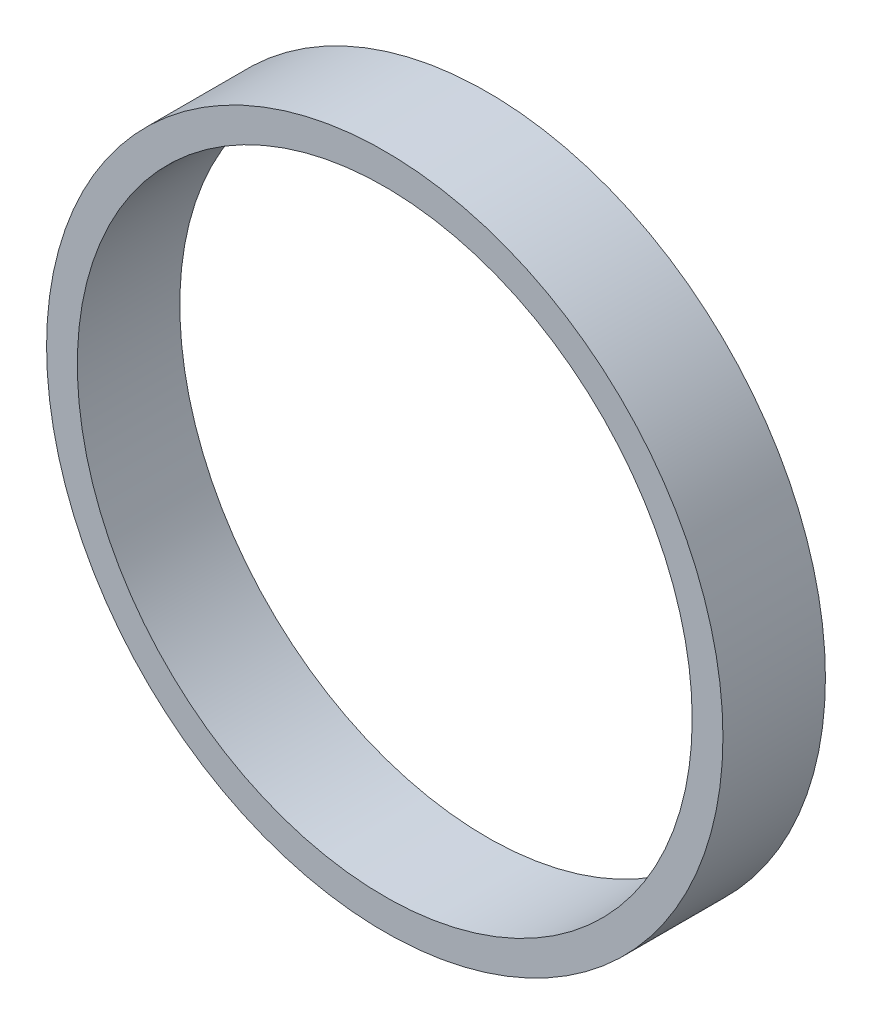
ISO-10303-21;
HEADER;
FILE_DESCRIPTION(('STEP AP214'),'2;1');
FILE_NAME('part.step','',(''),(''),'','','');
FILE_SCHEMA(('AUTOMOTIVE_DESIGN { 1 0 10303 214 1 1 1 1 }'));
ENDSEC;
DATA;
#1=APPLICATION_CONTEXT('core data for automotive mechanical design processes');
#2=APPLICATION_PROTOCOL_DEFINITION('international standard','automotive_design',2000,#1);
#3=PRODUCT_CONTEXT('',#1,'mechanical');
#4=PRODUCT('Part','Part','',(#3));
#5=PRODUCT_RELATED_PRODUCT_CATEGORY('part','',(#4));
#6=PRODUCT_DEFINITION_FORMATION('','',#4);
#7=PRODUCT_DEFINITION_CONTEXT('part definition',#1,'design');
#8=PRODUCT_DEFINITION('design','',#6,#7);
#9=PRODUCT_DEFINITION_SHAPE('','',#8);
#10=(LENGTH_UNIT() NAMED_UNIT(*) SI_UNIT(.MILLI.,.METRE.));
#11=(NAMED_UNIT(*) PLANE_ANGLE_UNIT() SI_UNIT($,.RADIAN.));
#12=(NAMED_UNIT(*) SI_UNIT($,.STERADIAN.) SOLID_ANGLE_UNIT());
#13=UNCERTAINTY_MEASURE_WITH_UNIT(LENGTH_MEASURE(1.E-05),#10,'distance_accuracy_value','');
#14=(GEOMETRIC_REPRESENTATION_CONTEXT(3) GLOBAL_UNCERTAINTY_ASSIGNED_CONTEXT((#13)) GLOBAL_UNIT_ASSIGNED_CONTEXT((#10,
#11,#12)) REPRESENTATION_CONTEXT('',''));
#15=CARTESIAN_POINT('',(0.,0.,0.));
#16=DIRECTION('',(0.,0.,1.));
#17=DIRECTION('',(1.,0.,0.));
#18=AXIS2_PLACEMENT_3D('',#15,#16,#17);
#19=CARTESIAN_POINT('',(0.,0.,5.));
#20=DIRECTION('',(0.,0.,1.));
#21=DIRECTION('',(1.,0.,0.));
#22=AXIS2_PLACEMENT_3D('',#19,#20,#21);
#23=PLANE('',#22);
#24=CARTESIAN_POINT('',(0.,0.,5.));
#25=DIRECTION('',(0.,0.,1.));
#26=DIRECTION('',(1.,0.,0.));
#27=AXIS2_PLACEMENT_3D('',#24,#25,#26);
#28=CIRCLE('',#27,16.5);
#29=CARTESIAN_POINT('',(16.5,0.,5.));
#30=VERTEX_POINT('',#29);
#31=EDGE_CURVE('E10',#30,#30,#28,.T.);
#32=ORIENTED_EDGE('',*,*,#31,.T.);
#33=EDGE_LOOP('',(#32));
#34=FACE_BOUND('',#33,.T.);
#35=CARTESIAN_POINT('',(0.,0.,5.));
#36=DIRECTION('',(0.,0.,1.));
#37=DIRECTION('',(1.,0.,0.));
#38=AXIS2_PLACEMENT_3D('',#35,#36,#37);
#39=CIRCLE('',#38,15.);
#40=CARTESIAN_POINT('',(15.,0.,5.));
#41=VERTEX_POINT('',#40);
#42=EDGE_CURVE('E56',#41,#41,#39,.T.);
#43=ORIENTED_EDGE('',*,*,#42,.F.);
#44=EDGE_LOOP('',(#43));
#45=FACE_BOUND('',#44,.T.);
#46=ADVANCED_FACE('F43',(#34,#45),#23,.T.);
#47=CARTESIAN_POINT('',(0.,0.,0.));
#48=DIRECTION('',(0.,0.,1.));
#49=DIRECTION('',(1.,0.,0.));
#50=AXIS2_PLACEMENT_3D('',#47,#48,#49);
#51=PLANE('',#50);
#52=CARTESIAN_POINT('',(0.,0.,0.));
#53=DIRECTION('',(0.,0.,1.));
#54=DIRECTION('',(1.,0.,0.));
#55=AXIS2_PLACEMENT_3D('',#52,#53,#54);
#56=CIRCLE('',#55,16.5);
#57=CARTESIAN_POINT('',(16.5,0.,0.));
#58=VERTEX_POINT('',#57);
#59=EDGE_CURVE('E47',#58,#58,#56,.T.);
#60=ORIENTED_EDGE('',*,*,#59,.F.);
#61=EDGE_LOOP('',(#60));
#62=FACE_BOUND('',#61,.T.);
#63=CARTESIAN_POINT('',(0.,0.,0.));
#64=DIRECTION('',(0.,0.,1.));
#65=DIRECTION('',(1.,0.,0.));
#66=AXIS2_PLACEMENT_3D('',#63,#64,#65);
#67=CIRCLE('',#66,15.);
#68=CARTESIAN_POINT('',(15.,0.,0.));
#69=VERTEX_POINT('',#68);
#70=EDGE_CURVE('E58',#69,#69,#67,.T.);
#71=ORIENTED_EDGE('',*,*,#70,.T.);
#72=EDGE_LOOP('',(#71));
#73=FACE_BOUND('',#72,.T.);
#74=ADVANCED_FACE('F70',(#62,#73),#51,.F.);
#75=CARTESIAN_POINT('',(0.,0.,5.));
#76=DIRECTION('',(0.,0.,-1.));
#77=DIRECTION('',(-1.,0.,0.));
#78=AXIS2_PLACEMENT_3D('',#75,#76,#77);
#79=CYLINDRICAL_SURFACE('',#78,16.5);
#80=ORIENTED_EDGE('',*,*,#31,.F.);
#81=EDGE_LOOP('',(#80));
#82=FACE_BOUND('',#81,.T.);
#83=ORIENTED_EDGE('',*,*,#59,.T.);
#84=EDGE_LOOP('',(#83));
#85=FACE_BOUND('',#84,.T.);
#86=ADVANCED_FACE('F45',(#82,#85),#79,.T.);
#87=CARTESIAN_POINT('',(0.,0.,5.));
#88=DIRECTION('',(0.,0.,-1.));
#89=DIRECTION('',(-1.,0.,0.));
#90=AXIS2_PLACEMENT_3D('',#87,#88,#89);
#91=CYLINDRICAL_SURFACE('',#90,15.);
#92=ORIENTED_EDGE('',*,*,#42,.T.);
#93=EDGE_LOOP('',(#92));
#94=FACE_BOUND('',#93,.T.);
#95=ORIENTED_EDGE('',*,*,#70,.F.);
#96=EDGE_LOOP('',(#95));
#97=FACE_BOUND('',#96,.T.);
#98=ADVANCED_FACE('F66',(#94,#97),#91,.F.);
#99=CLOSED_SHELL('',(#46,#74,#86,#98));
#100=MANIFOLD_SOLID_BREP('B2',#99);
#101=ADVANCED_BREP_SHAPE_REPRESENTATION('',(#18,#100),#14);
#102=SHAPE_DEFINITION_REPRESENTATION(#9,#101);
ENDSEC;
END-ISO-10303-21;
